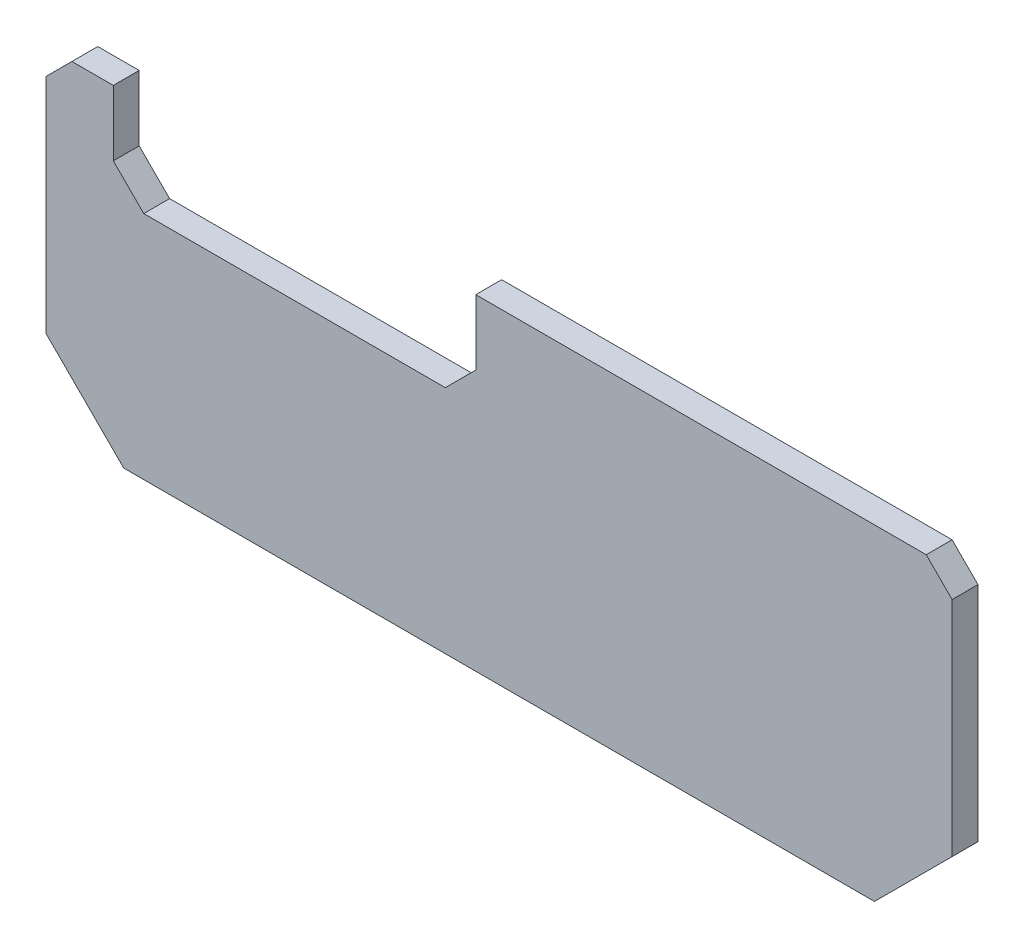
ISO-10303-21;
HEADER;
FILE_DESCRIPTION(('STEP AP214'),'2;1');
FILE_NAME('part.step','',(''),(''),'','','');
FILE_SCHEMA(('AUTOMOTIVE_DESIGN { 1 0 10303 214 1 1 1 1 }'));
ENDSEC;
DATA;
#1=APPLICATION_CONTEXT('core data for automotive mechanical design processes');
#2=APPLICATION_PROTOCOL_DEFINITION('international standard','automotive_design',2000,#1);
#3=PRODUCT_CONTEXT('',#1,'mechanical');
#4=PRODUCT('Part','Part','',(#3));
#5=PRODUCT_RELATED_PRODUCT_CATEGORY('part','',(#4));
#6=PRODUCT_DEFINITION_FORMATION('','',#4);
#7=PRODUCT_DEFINITION_CONTEXT('part definition',#1,'design');
#8=PRODUCT_DEFINITION('design','',#6,#7);
#9=PRODUCT_DEFINITION_SHAPE('','',#8);
#10=(LENGTH_UNIT() NAMED_UNIT(*) SI_UNIT(.MILLI.,.METRE.));
#11=(NAMED_UNIT(*) PLANE_ANGLE_UNIT() SI_UNIT($,.RADIAN.));
#12=(NAMED_UNIT(*) SI_UNIT($,.STERADIAN.) SOLID_ANGLE_UNIT());
#13=UNCERTAINTY_MEASURE_WITH_UNIT(LENGTH_MEASURE(1.E-05),#10,'distance_accuracy_value','');
#14=(GEOMETRIC_REPRESENTATION_CONTEXT(3) GLOBAL_UNCERTAINTY_ASSIGNED_CONTEXT((#13)) GLOBAL_UNIT_ASSIGNED_CONTEXT((#10,
#11,#12)) REPRESENTATION_CONTEXT('',''));
#15=CARTESIAN_POINT('',(0.,0.,0.));
#16=DIRECTION('',(0.,0.,1.));
#17=DIRECTION('',(1.,0.,0.));
#18=AXIS2_PLACEMENT_3D('',#15,#16,#17);
#19=CARTESIAN_POINT('',(-87.5,56.,5.));
#20=DIRECTION('',(0.,-1.,0.));
#21=DIRECTION('',(0.,0.,-1.));
#22=AXIS2_PLACEMENT_3D('',#19,#20,#21);
#23=PLANE('',#22);
#24=DIRECTION('',(-1.,0.,0.));
#25=VECTOR('',#24,1.);
#26=CARTESIAN_POINT('',(-87.5,56.,0.));
#27=LINE('',#26,#25);
#28=CARTESIAN_POINT('',(-74.5,55.9999999999999,0.));
#29=VERTEX_POINT('',#28);
#30=CARTESIAN_POINT('',(-82.5,56.,0.));
#31=VERTEX_POINT('',#30);
#32=EDGE_CURVE('E286',#29,#31,#27,.T.);
#33=ORIENTED_EDGE('',*,*,#32,.T.);
#34=DIRECTION('',(0.,0.,1.));
#35=VECTOR('',#34,1.);
#36=CARTESIAN_POINT('',(-82.5,56.,5.));
#37=LINE('',#36,#35);
#38=CARTESIAN_POINT('',(-82.5,56.,5.));
#39=VERTEX_POINT('',#38);
#40=EDGE_CURVE('E12',#31,#39,#37,.T.);
#41=ORIENTED_EDGE('',*,*,#40,.T.);
#42=DIRECTION('',(-1.,0.,0.));
#43=VECTOR('',#42,1.);
#44=CARTESIAN_POINT('',(-87.5,56.,5.));
#45=LINE('',#44,#43);
#46=CARTESIAN_POINT('',(-74.5,55.9999999999999,5.));
#47=VERTEX_POINT('',#46);
#48=EDGE_CURVE('E275',#47,#39,#45,.T.);
#49=ORIENTED_EDGE('',*,*,#48,.F.);
#50=DIRECTION('',(0.,0.,1.));
#51=VECTOR('',#50,1.);
#52=CARTESIAN_POINT('',(-74.5,55.9999999999999,-0.00100000000000013));
#53=LINE('',#52,#51);
#54=EDGE_CURVE('E263',#29,#47,#53,.T.);
#55=ORIENTED_EDGE('',*,*,#54,.F.);
#56=EDGE_LOOP('',(#33,#41,#49,#55));
#57=FACE_BOUND('',#56,.T.);
#58=ADVANCED_FACE('F109',(#57),#23,.F.);
#59=CARTESIAN_POINT('',(-87.5,56.,5.));
#60=DIRECTION('',(1.,0.,0.));
#61=DIRECTION('',(0.,1.,0.));
#62=AXIS2_PLACEMENT_3D('',#59,#60,#61);
#63=PLANE('',#62);
#64=DIRECTION('',(0.,-1.,0.));
#65=VECTOR('',#64,1.);
#66=CARTESIAN_POINT('',(-87.5,56.,5.));
#67=LINE('',#66,#65);
#68=CARTESIAN_POINT('',(-87.5,51.,5.));
#69=VERTEX_POINT('',#68);
#70=CARTESIAN_POINT('',(-87.5,8.0000000000001,5.));
#71=VERTEX_POINT('',#70);
#72=EDGE_CURVE('E266',#69,#71,#67,.T.);
#73=ORIENTED_EDGE('',*,*,#72,.F.);
#74=DIRECTION('',(0.,0.,-1.));
#75=VECTOR('',#74,1.);
#76=CARTESIAN_POINT('',(-87.5,51.,5.));
#77=LINE('',#76,#75);
#78=CARTESIAN_POINT('',(-87.5,51.,0.));
#79=VERTEX_POINT('',#78);
#80=EDGE_CURVE('E118',#69,#79,#77,.T.);
#81=ORIENTED_EDGE('',*,*,#80,.T.);
#82=DIRECTION('',(0.,-1.,0.));
#83=VECTOR('',#82,1.);
#84=CARTESIAN_POINT('',(-87.5,56.,0.));
#85=LINE('',#84,#83);
#86=CARTESIAN_POINT('',(-87.5,8.0000000000001,0.));
#87=VERTEX_POINT('',#86);
#88=EDGE_CURVE('E232',#79,#87,#85,.T.);
#89=ORIENTED_EDGE('',*,*,#88,.T.);
#90=DIRECTION('',(0.,0.,1.));
#91=VECTOR('',#90,1.);
#92=CARTESIAN_POINT('',(-87.5,8.0000000000001,5.));
#93=LINE('',#92,#91);
#94=EDGE_CURVE('E304',#87,#71,#93,.T.);
#95=ORIENTED_EDGE('',*,*,#94,.T.);
#96=EDGE_LOOP('',(#73,#81,#89,#95));
#97=FACE_BOUND('',#96,.T.);
#98=ADVANCED_FACE('F322',(#97),#63,.F.);
#99=CARTESIAN_POINT('',(-87.5,-6.99999999999997,5.));
#100=DIRECTION('',(0.,1.,0.));
#101=DIRECTION('',(0.,0.,1.));
#102=AXIS2_PLACEMENT_3D('',#99,#100,#101);
#103=PLANE('',#102);
#104=DIRECTION('',(1.,0.,0.));
#105=VECTOR('',#104,1.);
#106=CARTESIAN_POINT('',(-87.5,-6.99999999999997,0.));
#107=LINE('',#106,#105);
#108=CARTESIAN_POINT('',(-72.5,-6.99999999999997,0.));
#109=VERTEX_POINT('',#108);
#110=CARTESIAN_POINT('',(72.4999999999999,-6.99999999999997,0.));
#111=VERTEX_POINT('',#110);
#112=EDGE_CURVE('E280',#109,#111,#107,.T.);
#113=ORIENTED_EDGE('',*,*,#112,.T.);
#114=DIRECTION('',(0.,0.,1.));
#115=VECTOR('',#114,1.);
#116=CARTESIAN_POINT('',(72.4999999999999,-6.99999999999997,5.));
#117=LINE('',#116,#115);
#118=CARTESIAN_POINT('',(72.4999999999999,-6.99999999999997,5.));
#119=VERTEX_POINT('',#118);
#120=EDGE_CURVE('E298',#111,#119,#117,.T.);
#121=ORIENTED_EDGE('',*,*,#120,.T.);
#122=DIRECTION('',(1.,0.,0.));
#123=VECTOR('',#122,1.);
#124=CARTESIAN_POINT('',(-87.5,-6.99999999999997,5.));
#125=LINE('',#124,#123);
#126=CARTESIAN_POINT('',(-72.5,-6.99999999999997,5.));
#127=VERTEX_POINT('',#126);
#128=EDGE_CURVE('E268',#127,#119,#125,.T.);
#129=ORIENTED_EDGE('',*,*,#128,.F.);
#130=DIRECTION('',(0.,0.,-1.));
#131=VECTOR('',#130,1.);
#132=CARTESIAN_POINT('',(-72.5,-6.99999999999997,5.));
#133=LINE('',#132,#131);
#134=EDGE_CURVE('E295',#127,#109,#133,.T.);
#135=ORIENTED_EDGE('',*,*,#134,.T.);
#136=EDGE_LOOP('',(#113,#121,#129,#135));
#137=FACE_BOUND('',#136,.T.);
#138=ADVANCED_FACE('F335',(#137),#103,.F.);
#139=CARTESIAN_POINT('',(87.5,56.,5.));
#140=DIRECTION('',(-1.,0.,0.));
#141=DIRECTION('',(0.,0.,1.));
#142=AXIS2_PLACEMENT_3D('',#139,#140,#141);
#143=PLANE('',#142);
#144=DIRECTION('',(0.,1.,0.));
#145=VECTOR('',#144,1.);
#146=CARTESIAN_POINT('',(87.5,56.,0.));
#147=LINE('',#146,#145);
#148=CARTESIAN_POINT('',(87.5,8.00000000000001,0.));
#149=VERTEX_POINT('',#148);
#150=CARTESIAN_POINT('',(87.5,51.,0.));
#151=VERTEX_POINT('',#150);
#152=EDGE_CURVE('E283',#149,#151,#147,.T.);
#153=ORIENTED_EDGE('',*,*,#152,.T.);
#154=DIRECTION('',(0.,0.,1.));
#155=VECTOR('',#154,1.);
#156=CARTESIAN_POINT('',(87.5,51.,5.));
#157=LINE('',#156,#155);
#158=CARTESIAN_POINT('',(87.5,51.,5.));
#159=VERTEX_POINT('',#158);
#160=EDGE_CURVE('E314',#151,#159,#157,.T.);
#161=ORIENTED_EDGE('',*,*,#160,.T.);
#162=DIRECTION('',(0.,1.,0.));
#163=VECTOR('',#162,1.);
#164=CARTESIAN_POINT('',(87.5,56.,5.));
#165=LINE('',#164,#163);
#166=CARTESIAN_POINT('',(87.5,8.00000000000001,5.));
#167=VERTEX_POINT('',#166);
#168=EDGE_CURVE('E272',#167,#159,#165,.T.);
#169=ORIENTED_EDGE('',*,*,#168,.F.);
#170=DIRECTION('',(0.,0.,-1.));
#171=VECTOR('',#170,1.);
#172=CARTESIAN_POINT('',(87.5,8.00000000000001,5.));
#173=LINE('',#172,#171);
#174=EDGE_CURVE('E278',#167,#149,#173,.T.);
#175=ORIENTED_EDGE('',*,*,#174,.T.);
#176=EDGE_LOOP('',(#153,#161,#169,#175));
#177=FACE_BOUND('',#176,.T.);
#178=ADVANCED_FACE('F343',(#177),#143,.F.);
#179=CARTESIAN_POINT('',(82.5,56.,5.));
#180=VERTEX_POINT('',#179);
#181=CARTESIAN_POINT('',(-4.49999999999995,55.9999999999999,5.));
#182=VERTEX_POINT('',#181);
#183=EDGE_CURVE('E276',#180,#182,#45,.T.);
#184=ORIENTED_EDGE('',*,*,#183,.F.);
#185=DIRECTION('',(0.,0.,-1.));
#186=VECTOR('',#185,1.);
#187=CARTESIAN_POINT('',(82.5,56.,5.));
#188=LINE('',#187,#186);
#189=CARTESIAN_POINT('',(82.5,56.,0.));
#190=VERTEX_POINT('',#189);
#191=EDGE_CURVE('E307',#180,#190,#188,.T.);
#192=ORIENTED_EDGE('',*,*,#191,.T.);
#193=CARTESIAN_POINT('',(-4.49999999999995,56.,0.));
#194=VERTEX_POINT('',#193);
#195=EDGE_CURVE('E269',#190,#194,#27,.T.);
#196=ORIENTED_EDGE('',*,*,#195,.T.);
#197=DIRECTION('',(0.,0.,1.));
#198=VECTOR('',#197,1.);
#199=CARTESIAN_POINT('',(-4.49999999999995,55.9999999999999,-0.00100000000000013));
#200=LINE('',#199,#198);
#201=EDGE_CURVE('E222',#194,#182,#200,.T.);
#202=ORIENTED_EDGE('',*,*,#201,.T.);
#203=EDGE_LOOP('',(#184,#192,#196,#202));
#204=FACE_BOUND('',#203,.T.);
#205=ADVANCED_FACE('F351',(#204),#23,.F.);
#206=CARTESIAN_POINT('',(0.,0.,5.));
#207=DIRECTION('',(0.,0.,1.));
#208=DIRECTION('',(1.,0.,0.));
#209=AXIS2_PLACEMENT_3D('',#206,#207,#208);
#210=PLANE('',#209);
#211=ORIENTED_EDGE('',*,*,#168,.T.);
#212=DIRECTION('',(0.707106781186546,-0.707106781186549,0.));
#213=VECTOR('',#212,1.);
#214=CARTESIAN_POINT('',(69.2500000000002,69.2499999999999,5.));
#215=LINE('',#214,#213);
#216=EDGE_CURVE('E317',#159,#180,#215,.F.);
#217=ORIENTED_EDGE('',*,*,#216,.T.);
#218=ORIENTED_EDGE('',*,*,#183,.T.);
#219=DIRECTION('',(0.,1.,0.));
#220=VECTOR('',#219,1.);
#221=CARTESIAN_POINT('',(-4.49999999999995,43.3786796564403,5.));
#222=LINE('',#221,#220);
#223=CARTESIAN_POINT('',(-4.49999999999995,43.3786796564403,5.));
#224=VERTEX_POINT('',#223);
#225=EDGE_CURVE('E248',#224,#182,#222,.T.);
#226=ORIENTED_EDGE('',*,*,#225,.F.);
#227=DIRECTION('',(0.707106781186549,0.707106781186546,0.));
#228=VECTOR('',#227,1.);
#229=CARTESIAN_POINT('',(-10.3786796564403,37.5,5.));
#230=LINE('',#229,#228);
#231=CARTESIAN_POINT('',(-10.3786796564403,37.5,5.));
#232=VERTEX_POINT('',#231);
#233=EDGE_CURVE('E218',#232,#224,#230,.T.);
#234=ORIENTED_EDGE('',*,*,#233,.F.);
#235=DIRECTION('',(1.,0.,0.));
#236=VECTOR('',#235,1.);
#237=CARTESIAN_POINT('',(-68.6213203435596,37.5,5.));
#238=LINE('',#237,#236);
#239=CARTESIAN_POINT('',(-68.6213203435596,37.5,5.));
#240=VERTEX_POINT('',#239);
#241=EDGE_CURVE('E223',#240,#232,#238,.T.);
#242=ORIENTED_EDGE('',*,*,#241,.F.);
#243=DIRECTION('',(0.707106781186546,-0.707106781186549,0.));
#244=VECTOR('',#243,1.);
#245=CARTESIAN_POINT('',(-74.5,43.3786796564404,5.));
#246=LINE('',#245,#244);
#247=CARTESIAN_POINT('',(-74.5,43.3786796564404,5.));
#248=VERTEX_POINT('',#247);
#249=EDGE_CURVE('E253',#248,#240,#246,.T.);
#250=ORIENTED_EDGE('',*,*,#249,.F.);
#251=DIRECTION('',(0.,-1.,0.));
#252=VECTOR('',#251,1.);
#253=CARTESIAN_POINT('',(-74.5,55.9999999999999,5.));
#254=LINE('',#253,#252);
#255=EDGE_CURVE('E250',#47,#248,#254,.T.);
#256=ORIENTED_EDGE('',*,*,#255,.F.);
#257=ORIENTED_EDGE('',*,*,#48,.T.);
#258=DIRECTION('',(0.707106781186549,0.707106781186546,0.));
#259=VECTOR('',#258,1.);
#260=CARTESIAN_POINT('',(-69.2499999999998,69.2500000000002,5.));
#261=LINE('',#260,#259);
#262=EDGE_CURVE('E125',#39,#69,#261,.F.);
#263=ORIENTED_EDGE('',*,*,#262,.T.);
#264=ORIENTED_EDGE('',*,*,#72,.T.);
#265=DIRECTION('',(-0.707106781186546,0.70710678118655,0.));
#266=VECTOR('',#265,1.);
#267=CARTESIAN_POINT('',(-39.7500000000002,-39.75,5.));
#268=LINE('',#267,#266);
#269=EDGE_CURVE('E300',#71,#127,#268,.F.);
#270=ORIENTED_EDGE('',*,*,#269,.T.);
#271=ORIENTED_EDGE('',*,*,#128,.T.);
#272=DIRECTION('',(-0.707106781186549,-0.707106781186546,0.));
#273=VECTOR('',#272,1.);
#274=CARTESIAN_POINT('',(39.7499999999998,-39.75,5.));
#275=LINE('',#274,#273);
#276=EDGE_CURVE('E302',#119,#167,#275,.F.);
#277=ORIENTED_EDGE('',*,*,#276,.T.);
#278=EDGE_LOOP('',(#211,#217,#218,#226,#234,#242,#250,#256,#257,#263,#264,#270,#271,#277));
#279=FACE_BOUND('',#278,.T.);
#280=ADVANCED_FACE('F332',(#279),#210,.T.);
#281=CARTESIAN_POINT('',(0.,0.,0.));
#282=DIRECTION('',(0.,0.,1.));
#283=DIRECTION('',(1.,0.,0.));
#284=AXIS2_PLACEMENT_3D('',#281,#282,#283);
#285=PLANE('',#284);
#286=ORIENTED_EDGE('',*,*,#195,.F.);
#287=DIRECTION('',(-0.707106781186546,0.707106781186549,0.));
#288=VECTOR('',#287,1.);
#289=CARTESIAN_POINT('',(82.5,56.,0.));
#290=LINE('',#289,#288);
#291=EDGE_CURVE('E312',#190,#151,#290,.F.);
#292=ORIENTED_EDGE('',*,*,#291,.T.);
#293=ORIENTED_EDGE('',*,*,#152,.F.);
#294=DIRECTION('',(0.707106781186549,0.707106781186546,0.));
#295=VECTOR('',#294,1.);
#296=CARTESIAN_POINT('',(87.5,8.00000000000001,0.));
#297=LINE('',#296,#295);
#298=EDGE_CURVE('E293',#149,#111,#297,.F.);
#299=ORIENTED_EDGE('',*,*,#298,.T.);
#300=ORIENTED_EDGE('',*,*,#112,.F.);
#301=DIRECTION('',(0.707106781186546,-0.70710678118655,0.));
#302=VECTOR('',#301,1.);
#303=CARTESIAN_POINT('',(-72.5,-6.99999999999997,0.));
#304=LINE('',#303,#302);
#305=EDGE_CURVE('E290',#109,#87,#304,.F.);
#306=ORIENTED_EDGE('',*,*,#305,.T.);
#307=ORIENTED_EDGE('',*,*,#88,.F.);
#308=DIRECTION('',(-0.707106781186549,-0.707106781186546,0.));
#309=VECTOR('',#308,1.);
#310=CARTESIAN_POINT('',(-87.5,51.,0.));
#311=LINE('',#310,#309);
#312=EDGE_CURVE('E310',#79,#31,#311,.F.);
#313=ORIENTED_EDGE('',*,*,#312,.T.);
#314=ORIENTED_EDGE('',*,*,#32,.F.);
#315=DIRECTION('',(0.,1.,0.));
#316=VECTOR('',#315,1.);
#317=CARTESIAN_POINT('',(-74.5,55.9999999999999,0.));
#318=LINE('',#317,#316);
#319=CARTESIAN_POINT('',(-74.5,43.3786796564404,0.));
#320=VERTEX_POINT('',#319);
#321=EDGE_CURVE('E245',#320,#29,#318,.T.);
#322=ORIENTED_EDGE('',*,*,#321,.F.);
#323=DIRECTION('',(-0.707106781186546,0.707106781186549,0.));
#324=VECTOR('',#323,1.);
#325=CARTESIAN_POINT('',(-74.5,43.3786796564404,0.));
#326=LINE('',#325,#324);
#327=CARTESIAN_POINT('',(-68.6213203435596,37.5,0.));
#328=VERTEX_POINT('',#327);
#329=EDGE_CURVE('E240',#328,#320,#326,.T.);
#330=ORIENTED_EDGE('',*,*,#329,.F.);
#331=DIRECTION('',(-1.,0.,0.));
#332=VECTOR('',#331,1.);
#333=CARTESIAN_POINT('',(-68.6213203435596,37.5,0.));
#334=LINE('',#333,#332);
#335=CARTESIAN_POINT('',(-10.3786796564403,37.5,0.));
#336=VERTEX_POINT('',#335);
#337=EDGE_CURVE('E238',#336,#328,#334,.T.);
#338=ORIENTED_EDGE('',*,*,#337,.F.);
#339=DIRECTION('',(-0.70710678118655,-0.707106781186546,0.));
#340=VECTOR('',#339,1.);
#341=CARTESIAN_POINT('',(-10.3786796564403,37.5,0.));
#342=LINE('',#341,#340);
#343=CARTESIAN_POINT('',(-4.49999999999995,43.3786796564403,0.));
#344=VERTEX_POINT('',#343);
#345=EDGE_CURVE('E215',#344,#336,#342,.T.);
#346=ORIENTED_EDGE('',*,*,#345,.F.);
#347=DIRECTION('',(0.,-1.,0.));
#348=VECTOR('',#347,1.);
#349=CARTESIAN_POINT('',(-4.49999999999995,43.3786796564403,0.));
#350=LINE('',#349,#348);
#351=EDGE_CURVE('E227',#194,#344,#350,.T.);
#352=ORIENTED_EDGE('',*,*,#351,.F.);
#353=EDGE_LOOP('',(#286,#292,#293,#299,#300,#306,#307,#313,#314,#322,#330,#338,#346,#352));
#354=FACE_BOUND('',#353,.T.);
#355=ADVANCED_FACE('F235',(#354),#285,.F.);
#356=CARTESIAN_POINT('',(-10.3786796564403,37.5,-0.00100000000000013));
#357=DIRECTION('',(0.707106781186545,-0.707106781186549,0.));
#358=DIRECTION('',(0.70710678118655,0.707106781186546,0.));
#359=AXIS2_PLACEMENT_3D('',#356,#357,#358);
#360=PLANE('',#359);
#361=ORIENTED_EDGE('',*,*,#345,.T.);
#362=DIRECTION('',(0.,0.,1.));
#363=VECTOR('',#362,1.);
#364=CARTESIAN_POINT('',(-10.3786796564403,37.5,-0.00100000000000013));
#365=LINE('',#364,#363);
#366=EDGE_CURVE('E233',#336,#232,#365,.T.);
#367=ORIENTED_EDGE('',*,*,#366,.T.);
#368=ORIENTED_EDGE('',*,*,#233,.T.);
#369=DIRECTION('',(0.,0.,1.));
#370=VECTOR('',#369,1.);
#371=CARTESIAN_POINT('',(-4.49999999999995,43.3786796564403,-0.00100000000000013));
#372=LINE('',#371,#370);
#373=EDGE_CURVE('E211',#344,#224,#372,.T.);
#374=ORIENTED_EDGE('',*,*,#373,.F.);
#375=EDGE_LOOP('',(#361,#367,#368,#374));
#376=FACE_BOUND('',#375,.T.);
#377=ADVANCED_FACE('F213',(#376),#360,.F.);
#378=CARTESIAN_POINT('',(-68.6213203435596,37.5,-0.00100000000000013));
#379=DIRECTION('',(0.,-1.,0.));
#380=DIRECTION('',(0.,0.,-1.));
#381=AXIS2_PLACEMENT_3D('',#378,#379,#380);
#382=PLANE('',#381);
#383=ORIENTED_EDGE('',*,*,#337,.T.);
#384=DIRECTION('',(0.,0.,1.));
#385=VECTOR('',#384,1.);
#386=CARTESIAN_POINT('',(-68.6213203435596,37.5,-0.00100000000000013));
#387=LINE('',#386,#385);
#388=EDGE_CURVE('E259',#328,#240,#387,.T.);
#389=ORIENTED_EDGE('',*,*,#388,.T.);
#390=ORIENTED_EDGE('',*,*,#241,.T.);
#391=ORIENTED_EDGE('',*,*,#366,.F.);
#392=EDGE_LOOP('',(#383,#389,#390,#391));
#393=FACE_BOUND('',#392,.T.);
#394=ADVANCED_FACE('F440',(#393),#382,.F.);
#395=CARTESIAN_POINT('',(-74.5,43.3786796564404,-0.00100000000000013));
#396=DIRECTION('',(-0.707106781186549,-0.707106781186546,0.));
#397=DIRECTION('',(0.707106781186546,-0.707106781186549,0.));
#398=AXIS2_PLACEMENT_3D('',#395,#396,#397);
#399=PLANE('',#398);
#400=ORIENTED_EDGE('',*,*,#329,.T.);
#401=DIRECTION('',(0.,0.,1.));
#402=VECTOR('',#401,1.);
#403=CARTESIAN_POINT('',(-74.5,43.3786796564404,-0.00100000000000013));
#404=LINE('',#403,#402);
#405=EDGE_CURVE('E261',#320,#248,#404,.T.);
#406=ORIENTED_EDGE('',*,*,#405,.T.);
#407=ORIENTED_EDGE('',*,*,#249,.T.);
#408=ORIENTED_EDGE('',*,*,#388,.F.);
#409=EDGE_LOOP('',(#400,#406,#407,#408));
#410=FACE_BOUND('',#409,.T.);
#411=ADVANCED_FACE('F431',(#410),#399,.F.);
#412=CARTESIAN_POINT('',(-74.5,55.9999999999999,-0.00100000000000013));
#413=DIRECTION('',(-1.,0.,0.));
#414=DIRECTION('',(0.,0.,1.));
#415=AXIS2_PLACEMENT_3D('',#412,#413,#414);
#416=PLANE('',#415);
#417=ORIENTED_EDGE('',*,*,#321,.T.);
#418=ORIENTED_EDGE('',*,*,#54,.T.);
#419=ORIENTED_EDGE('',*,*,#255,.T.);
#420=ORIENTED_EDGE('',*,*,#405,.F.);
#421=EDGE_LOOP('',(#417,#418,#419,#420));
#422=FACE_BOUND('',#421,.T.);
#423=ADVANCED_FACE('F424',(#422),#416,.F.);
#424=CARTESIAN_POINT('',(-4.49999999999995,43.3786796564403,-0.00100000000000013));
#425=DIRECTION('',(1.,0.,0.));
#426=DIRECTION('',(0.,0.,-1.));
#427=AXIS2_PLACEMENT_3D('',#424,#425,#426);
#428=PLANE('',#427);
#429=ORIENTED_EDGE('',*,*,#351,.T.);
#430=ORIENTED_EDGE('',*,*,#373,.T.);
#431=ORIENTED_EDGE('',*,*,#225,.T.);
#432=ORIENTED_EDGE('',*,*,#201,.F.);
#433=EDGE_LOOP('',(#429,#430,#431,#432));
#434=FACE_BOUND('',#433,.T.);
#435=ADVANCED_FACE('F228',(#434),#428,.F.);
#436=CARTESIAN_POINT('',(87.5,8.00000000000001,5.));
#437=DIRECTION('',(-0.707106781186546,0.707106781186549,0.));
#438=DIRECTION('',(0.,0.,-1.));
#439=AXIS2_PLACEMENT_3D('',#436,#437,#438);
#440=PLANE('',#439);
#441=ORIENTED_EDGE('',*,*,#276,.F.);
#442=ORIENTED_EDGE('',*,*,#120,.F.);
#443=ORIENTED_EDGE('',*,*,#298,.F.);
#444=ORIENTED_EDGE('',*,*,#174,.F.);
#445=EDGE_LOOP('',(#441,#442,#443,#444));
#446=FACE_BOUND('',#445,.T.);
#447=ADVANCED_FACE('F338',(#446),#440,.F.);
#448=CARTESIAN_POINT('',(-72.5,-6.99999999999997,5.));
#449=DIRECTION('',(0.707106781186549,0.707106781186545,0.));
#450=DIRECTION('',(0.,0.,-1.));
#451=AXIS2_PLACEMENT_3D('',#448,#449,#450);
#452=PLANE('',#451);
#453=ORIENTED_EDGE('',*,*,#269,.F.);
#454=ORIENTED_EDGE('',*,*,#94,.F.);
#455=ORIENTED_EDGE('',*,*,#305,.F.);
#456=ORIENTED_EDGE('',*,*,#134,.F.);
#457=EDGE_LOOP('',(#453,#454,#455,#456));
#458=FACE_BOUND('',#457,.T.);
#459=ADVANCED_FACE('F330',(#458),#452,.F.);
#460=CARTESIAN_POINT('',(82.5,56.,5.));
#461=DIRECTION('',(-0.707106781186549,-0.707106781186545,0.));
#462=DIRECTION('',(0.,0.,-1.));
#463=AXIS2_PLACEMENT_3D('',#460,#461,#462);
#464=PLANE('',#463);
#465=ORIENTED_EDGE('',*,*,#216,.F.);
#466=ORIENTED_EDGE('',*,*,#160,.F.);
#467=ORIENTED_EDGE('',*,*,#291,.F.);
#468=ORIENTED_EDGE('',*,*,#191,.F.);
#469=EDGE_LOOP('',(#465,#466,#467,#468));
#470=FACE_BOUND('',#469,.T.);
#471=ADVANCED_FACE('F347',(#470),#464,.F.);
#472=CARTESIAN_POINT('',(-87.5,51.,5.));
#473=DIRECTION('',(0.707106781186545,-0.707106781186549,0.));
#474=DIRECTION('',(0.,0.,-1.));
#475=AXIS2_PLACEMENT_3D('',#472,#473,#474);
#476=PLANE('',#475);
#477=ORIENTED_EDGE('',*,*,#262,.F.);
#478=ORIENTED_EDGE('',*,*,#40,.F.);
#479=ORIENTED_EDGE('',*,*,#312,.F.);
#480=ORIENTED_EDGE('',*,*,#80,.F.);
#481=EDGE_LOOP('',(#477,#478,#479,#480));
#482=FACE_BOUND('',#481,.T.);
#483=ADVANCED_FACE('F112',(#482),#476,.F.);
#484=CLOSED_SHELL('',(#58,#98,#138,#178,#205,#280,#355,#377,#394,#411,#423,#435,#447,#459,#471,#483));
#485=MANIFOLD_SOLID_BREP('B2',#484);
#486=ADVANCED_BREP_SHAPE_REPRESENTATION('',(#18,#485),#14);
#487=SHAPE_DEFINITION_REPRESENTATION(#9,#486);
ENDSEC;
END-ISO-10303-21;
